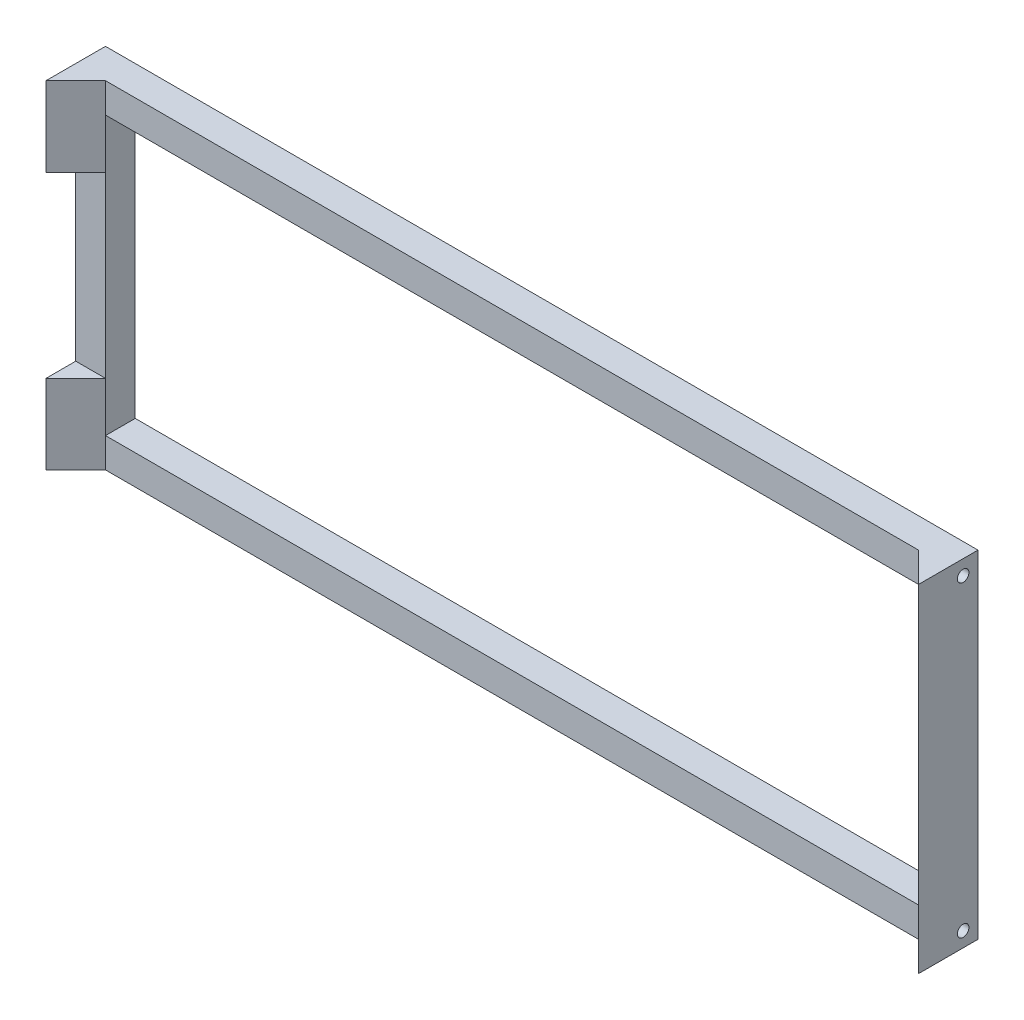
ISO-10303-21;
HEADER;
FILE_DESCRIPTION(('STEP AP214'),'2;1');
FILE_NAME('part.step','',(''),(''),'','','');
FILE_SCHEMA(('AUTOMOTIVE_DESIGN { 1 0 10303 214 1 1 1 1 }'));
ENDSEC;
DATA;
#1=APPLICATION_CONTEXT('core data for automotive mechanical design processes');
#2=APPLICATION_PROTOCOL_DEFINITION('international standard','automotive_design',2000,#1);
#3=PRODUCT_CONTEXT('',#1,'mechanical');
#4=PRODUCT('Part','Part','',(#3));
#5=PRODUCT_RELATED_PRODUCT_CATEGORY('part','',(#4));
#6=PRODUCT_DEFINITION_FORMATION('','',#4);
#7=PRODUCT_DEFINITION_CONTEXT('part definition',#1,'design');
#8=PRODUCT_DEFINITION('design','',#6,#7);
#9=PRODUCT_DEFINITION_SHAPE('','',#8);
#10=(LENGTH_UNIT() NAMED_UNIT(*) SI_UNIT(.MILLI.,.METRE.));
#11=(NAMED_UNIT(*) PLANE_ANGLE_UNIT() SI_UNIT($,.RADIAN.));
#12=(NAMED_UNIT(*) SI_UNIT($,.STERADIAN.) SOLID_ANGLE_UNIT());
#13=UNCERTAINTY_MEASURE_WITH_UNIT(LENGTH_MEASURE(1.E-05),#10,'distance_accuracy_value','');
#14=(GEOMETRIC_REPRESENTATION_CONTEXT(3) GLOBAL_UNCERTAINTY_ASSIGNED_CONTEXT((#13)) GLOBAL_UNIT_ASSIGNED_CONTEXT((#10,
#11,#12)) REPRESENTATION_CONTEXT('',''));
#15=CARTESIAN_POINT('',(0.,0.,0.));
#16=DIRECTION('',(0.,0.,1.));
#17=DIRECTION('',(1.,0.,0.));
#18=AXIS2_PLACEMENT_3D('',#15,#16,#17);
#19=CARTESIAN_POINT('',(0.,0.,7.5));
#20=DIRECTION('',(0.,0.,1.));
#21=DIRECTION('',(1.,0.,0.));
#22=AXIS2_PLACEMENT_3D('',#19,#20,#21);
#23=PLANE('',#22);
#24=DIRECTION('',(1.,0.,0.));
#25=VECTOR('',#24,1.);
#26=CARTESIAN_POINT('',(-102.5,-35.,7.5));
#27=LINE('',#26,#25);
#28=CARTESIAN_POINT('',(-102.5,-35.,7.5));
#29=VERTEX_POINT('',#28);
#30=CARTESIAN_POINT('',(102.5,-35.,7.5));
#31=VERTEX_POINT('',#30);
#32=EDGE_CURVE('E259',#29,#31,#27,.T.);
#33=ORIENTED_EDGE('',*,*,#32,.F.);
#34=DIRECTION('',(0.,-1.,0.));
#35=VECTOR('',#34,1.);
#36=CARTESIAN_POINT('',(-102.5,-22.5,7.5));
#37=LINE('',#36,#35);
#38=CARTESIAN_POINT('',(-102.5,-42.5,7.5));
#39=VERTEX_POINT('',#38);
#40=EDGE_CURVE('E167',#29,#39,#37,.T.);
#41=ORIENTED_EDGE('',*,*,#40,.T.);
#42=DIRECTION('',(1.,0.,0.));
#43=VECTOR('',#42,1.);
#44=CARTESIAN_POINT('',(-110.,-42.5,7.5));
#45=LINE('',#44,#43);
#46=CARTESIAN_POINT('',(102.5,-42.5,7.5));
#47=VERTEX_POINT('',#46);
#48=EDGE_CURVE('E303',#39,#47,#45,.T.);
#49=ORIENTED_EDGE('',*,*,#48,.T.);
#50=DIRECTION('',(0.,1.,0.));
#51=VECTOR('',#50,1.);
#52=CARTESIAN_POINT('',(102.5,-42.5,7.5));
#53=LINE('',#52,#51);
#54=EDGE_CURVE('E60',#47,#31,#53,.T.);
#55=ORIENTED_EDGE('',*,*,#54,.T.);
#56=EDGE_LOOP('',(#33,#41,#49,#55));
#57=FACE_BOUND('',#56,.T.);
#58=ADVANCED_FACE('F49',(#57),#23,.T.);
#59=DIRECTION('',(0.,-1.,0.));
#60=VECTOR('',#59,1.);
#61=CARTESIAN_POINT('',(-110.,-42.5,7.5));
#62=LINE('',#61,#60);
#63=CARTESIAN_POINT('',(-110.,22.5,7.5));
#64=VERTEX_POINT('',#63);
#65=CARTESIAN_POINT('',(-110.,-22.5,7.5));
#66=VERTEX_POINT('',#65);
#67=EDGE_CURVE('E299',#64,#66,#62,.T.);
#68=ORIENTED_EDGE('',*,*,#67,.T.);
#69=DIRECTION('',(-1.,0.,0.));
#70=VECTOR('',#69,1.);
#71=CARTESIAN_POINT('',(0.,-22.5,7.5));
#72=LINE('',#71,#70);
#73=CARTESIAN_POINT('',(-102.5,-22.5,7.5));
#74=VERTEX_POINT('',#73);
#75=EDGE_CURVE('E153',#74,#66,#72,.T.);
#76=ORIENTED_EDGE('',*,*,#75,.F.);
#77=DIRECTION('',(0.,-1.,0.));
#78=VECTOR('',#77,1.);
#79=CARTESIAN_POINT('',(-102.5,-35.,7.5));
#80=LINE('',#79,#78);
#81=CARTESIAN_POINT('',(-102.5,22.5,7.5));
#82=VERTEX_POINT('',#81);
#83=EDGE_CURVE('E253',#82,#74,#80,.T.);
#84=ORIENTED_EDGE('',*,*,#83,.F.);
#85=DIRECTION('',(-1.,0.,0.));
#86=VECTOR('',#85,1.);
#87=CARTESIAN_POINT('',(-102.5,22.5,7.5));
#88=LINE('',#87,#86);
#89=EDGE_CURVE('E185',#82,#64,#88,.T.);
#90=ORIENTED_EDGE('',*,*,#89,.T.);
#91=EDGE_LOOP('',(#68,#76,#84,#90));
#92=FACE_BOUND('',#91,.T.);
#93=ADVANCED_FACE('F406',(#92),#23,.T.);
#94=DIRECTION('',(0.,1.,0.));
#95=VECTOR('',#94,1.);
#96=CARTESIAN_POINT('',(-102.5,22.5,7.5));
#97=LINE('',#96,#95);
#98=CARTESIAN_POINT('',(-102.5,35.,7.5));
#99=VERTEX_POINT('',#98);
#100=CARTESIAN_POINT('',(-102.5,42.5,7.5));
#101=VERTEX_POINT('',#100);
#102=EDGE_CURVE('E199',#99,#101,#97,.T.);
#103=ORIENTED_EDGE('',*,*,#102,.F.);
#104=DIRECTION('',(-1.,0.,0.));
#105=VECTOR('',#104,1.);
#106=CARTESIAN_POINT('',(-102.5,35.,7.5));
#107=LINE('',#106,#105);
#108=CARTESIAN_POINT('',(102.5,35.,7.5));
#109=VERTEX_POINT('',#108);
#110=EDGE_CURVE('E249',#109,#99,#107,.T.);
#111=ORIENTED_EDGE('',*,*,#110,.F.);
#112=CARTESIAN_POINT('',(102.5,42.5,7.5));
#113=VERTEX_POINT('',#112);
#114=EDGE_CURVE('E11',#109,#113,#53,.T.);
#115=ORIENTED_EDGE('',*,*,#114,.T.);
#116=DIRECTION('',(-1.,0.,0.));
#117=VECTOR('',#116,1.);
#118=CARTESIAN_POINT('',(-110.,42.5,7.5));
#119=LINE('',#118,#117);
#120=EDGE_CURVE('E295',#113,#101,#119,.T.);
#121=ORIENTED_EDGE('',*,*,#120,.T.);
#122=EDGE_LOOP('',(#103,#111,#115,#121));
#123=FACE_BOUND('',#122,.T.);
#124=ADVANCED_FACE('F419',(#123),#23,.T.);
#125=CARTESIAN_POINT('',(0.,0.,0.));
#126=DIRECTION('',(0.,0.,1.));
#127=DIRECTION('',(1.,0.,0.));
#128=AXIS2_PLACEMENT_3D('',#125,#126,#127);
#129=PLANE('',#128);
#130=DIRECTION('',(-1.,0.,0.));
#131=VECTOR('',#130,1.);
#132=CARTESIAN_POINT('',(-110.,42.5,0.));
#133=LINE('',#132,#131);
#134=CARTESIAN_POINT('',(110.,42.5,0.));
#135=VERTEX_POINT('',#134);
#136=CARTESIAN_POINT('',(-110.,42.5,0.));
#137=VERTEX_POINT('',#136);
#138=EDGE_CURVE('E294',#135,#137,#133,.T.);
#139=ORIENTED_EDGE('',*,*,#138,.F.);
#140=DIRECTION('',(0.,1.,0.));
#141=VECTOR('',#140,1.);
#142=CARTESIAN_POINT('',(110.,-42.5,0.));
#143=LINE('',#142,#141);
#144=CARTESIAN_POINT('',(110.,-42.5,0.));
#145=VERTEX_POINT('',#144);
#146=EDGE_CURVE('E300',#145,#135,#143,.T.);
#147=ORIENTED_EDGE('',*,*,#146,.F.);
#148=DIRECTION('',(1.,0.,0.));
#149=VECTOR('',#148,1.);
#150=CARTESIAN_POINT('',(-110.,-42.5,0.));
#151=LINE('',#150,#149);
#152=CARTESIAN_POINT('',(-110.,-42.5,0.));
#153=VERTEX_POINT('',#152);
#154=EDGE_CURVE('E313',#153,#145,#151,.T.);
#155=ORIENTED_EDGE('',*,*,#154,.F.);
#156=DIRECTION('',(0.,-1.,0.));
#157=VECTOR('',#156,1.);
#158=CARTESIAN_POINT('',(-110.,-42.5,0.));
#159=LINE('',#158,#157);
#160=EDGE_CURVE('E310',#137,#153,#159,.T.);
#161=ORIENTED_EDGE('',*,*,#160,.F.);
#162=EDGE_LOOP('',(#139,#147,#155,#161));
#163=FACE_BOUND('',#162,.T.);
#164=DIRECTION('',(-1.,0.,0.));
#165=VECTOR('',#164,1.);
#166=CARTESIAN_POINT('',(-102.5,35.,0.));
#167=LINE('',#166,#165);
#168=CARTESIAN_POINT('',(102.5,35.,0.));
#169=VERTEX_POINT('',#168);
#170=CARTESIAN_POINT('',(-102.5,35.,0.));
#171=VERTEX_POINT('',#170);
#172=EDGE_CURVE('E237',#169,#171,#167,.T.);
#173=ORIENTED_EDGE('',*,*,#172,.T.);
#174=DIRECTION('',(0.,-1.,0.));
#175=VECTOR('',#174,1.);
#176=CARTESIAN_POINT('',(-102.5,-35.,0.));
#177=LINE('',#176,#175);
#178=CARTESIAN_POINT('',(-102.5,-35.,0.));
#179=VERTEX_POINT('',#178);
#180=EDGE_CURVE('E271',#171,#179,#177,.T.);
#181=ORIENTED_EDGE('',*,*,#180,.T.);
#182=DIRECTION('',(1.,0.,0.));
#183=VECTOR('',#182,1.);
#184=CARTESIAN_POINT('',(-102.5,-35.,0.));
#185=LINE('',#184,#183);
#186=CARTESIAN_POINT('',(102.5,-35.,0.));
#187=VERTEX_POINT('',#186);
#188=EDGE_CURVE('E274',#179,#187,#185,.T.);
#189=ORIENTED_EDGE('',*,*,#188,.T.);
#190=DIRECTION('',(0.,1.,0.));
#191=VECTOR('',#190,1.);
#192=CARTESIAN_POINT('',(102.5,-35.,0.));
#193=LINE('',#192,#191);
#194=EDGE_CURVE('E254',#187,#169,#193,.T.);
#195=ORIENTED_EDGE('',*,*,#194,.T.);
#196=EDGE_LOOP('',(#173,#181,#189,#195));
#197=FACE_BOUND('',#196,.T.);
#198=ADVANCED_FACE('F336',(#163,#197),#129,.F.);
#199=CARTESIAN_POINT('',(-110.,42.5,7.5));
#200=DIRECTION('',(0.,-1.,0.));
#201=DIRECTION('',(1.,0.,0.));
#202=AXIS2_PLACEMENT_3D('',#199,#200,#201);
#203=PLANE('',#202);
#204=ORIENTED_EDGE('',*,*,#138,.T.);
#205=DIRECTION('',(0.,0.,-1.));
#206=VECTOR('',#205,1.);
#207=CARTESIAN_POINT('',(-110.,42.5,7.5));
#208=LINE('',#207,#206);
#209=CARTESIAN_POINT('',(-110.,42.5,15.));
#210=VERTEX_POINT('',#209);
#211=EDGE_CURVE('E53',#210,#137,#208,.T.);
#212=ORIENTED_EDGE('',*,*,#211,.F.);
#213=DIRECTION('',(0.707106781186547,0.,-0.707106781186548));
#214=VECTOR('',#213,1.);
#215=CARTESIAN_POINT('',(-110.,42.5,15.));
#216=LINE('',#215,#214);
#217=EDGE_CURVE('E183',#210,#101,#216,.T.);
#218=ORIENTED_EDGE('',*,*,#217,.T.);
#219=ORIENTED_EDGE('',*,*,#120,.F.);
#220=DIRECTION('',(-0.707106781186547,0.,-0.707106781186548));
#221=VECTOR('',#220,1.);
#222=CARTESIAN_POINT('',(110.,42.5,15.));
#223=LINE('',#222,#221);
#224=CARTESIAN_POINT('',(110.,42.5,15.));
#225=VERTEX_POINT('',#224);
#226=EDGE_CURVE('E75',#225,#113,#223,.T.);
#227=ORIENTED_EDGE('',*,*,#226,.F.);
#228=DIRECTION('',(0.,0.,-1.));
#229=VECTOR('',#228,1.);
#230=CARTESIAN_POINT('',(110.,42.5,7.5));
#231=LINE('',#230,#229);
#232=EDGE_CURVE('E306',#225,#135,#231,.T.);
#233=ORIENTED_EDGE('',*,*,#232,.T.);
#234=EDGE_LOOP('',(#204,#212,#218,#219,#227,#233));
#235=FACE_BOUND('',#234,.T.);
#236=ADVANCED_FACE('F51',(#235),#203,.F.);
#237=CARTESIAN_POINT('',(-110.,-42.5,7.5));
#238=DIRECTION('',(1.,0.,0.));
#239=DIRECTION('',(0.,0.,-1.));
#240=AXIS2_PLACEMENT_3D('',#237,#238,#239);
#241=PLANE('',#240);
#242=CARTESIAN_POINT('',(-110.,38.75,3.75));
#243=DIRECTION('',(-1.,0.,0.));
#244=DIRECTION('',(0.,0.,1.));
#245=AXIS2_PLACEMENT_3D('',#242,#243,#244);
#246=CIRCLE('',#245,1.45);
#247=CARTESIAN_POINT('',(-110.,38.75,5.2));
#248=VERTEX_POINT('',#247);
#249=EDGE_CURVE('E238',#248,#248,#246,.T.);
#250=ORIENTED_EDGE('',*,*,#249,.F.);
#251=EDGE_LOOP('',(#250));
#252=FACE_BOUND('',#251,.T.);
#253=CARTESIAN_POINT('',(-110.,-38.75,3.75));
#254=DIRECTION('',(-1.,0.,0.));
#255=DIRECTION('',(0.,0.,1.));
#256=AXIS2_PLACEMENT_3D('',#253,#254,#255);
#257=CIRCLE('',#256,1.45);
#258=CARTESIAN_POINT('',(-110.,-38.75,5.2));
#259=VERTEX_POINT('',#258);
#260=EDGE_CURVE('E242',#259,#259,#257,.T.);
#261=ORIENTED_EDGE('',*,*,#260,.F.);
#262=EDGE_LOOP('',(#261));
#263=FACE_BOUND('',#262,.T.);
#264=ORIENTED_EDGE('',*,*,#160,.T.);
#265=DIRECTION('',(0.,0.,-1.));
#266=VECTOR('',#265,1.);
#267=CARTESIAN_POINT('',(-110.,-42.5,7.5));
#268=LINE('',#267,#266);
#269=CARTESIAN_POINT('',(-110.,-42.5,15.));
#270=VERTEX_POINT('',#269);
#271=EDGE_CURVE('E163',#270,#153,#268,.T.);
#272=ORIENTED_EDGE('',*,*,#271,.F.);
#273=DIRECTION('',(0.,-1.,0.));
#274=VECTOR('',#273,1.);
#275=CARTESIAN_POINT('',(-110.,-22.5,15.));
#276=LINE('',#275,#274);
#277=CARTESIAN_POINT('',(-110.,-22.5,15.));
#278=VERTEX_POINT('',#277);
#279=EDGE_CURVE('E160',#278,#270,#276,.T.);
#280=ORIENTED_EDGE('',*,*,#279,.F.);
#281=DIRECTION('',(0.,0.,1.));
#282=VECTOR('',#281,1.);
#283=CARTESIAN_POINT('',(-110.,-22.5,0.));
#284=LINE('',#283,#282);
#285=EDGE_CURVE('E146',#66,#278,#284,.T.);
#286=ORIENTED_EDGE('',*,*,#285,.F.);
#287=ORIENTED_EDGE('',*,*,#67,.F.);
#288=DIRECTION('',(0.,0.,1.));
#289=VECTOR('',#288,1.);
#290=CARTESIAN_POINT('',(-110.,22.5,7.5));
#291=LINE('',#290,#289);
#292=CARTESIAN_POINT('',(-110.,22.5,15.));
#293=VERTEX_POINT('',#292);
#294=EDGE_CURVE('E189',#64,#293,#291,.T.);
#295=ORIENTED_EDGE('',*,*,#294,.T.);
#296=DIRECTION('',(0.,1.,0.));
#297=VECTOR('',#296,1.);
#298=CARTESIAN_POINT('',(-110.,22.5,15.));
#299=LINE('',#298,#297);
#300=EDGE_CURVE('E195',#293,#210,#299,.T.);
#301=ORIENTED_EDGE('',*,*,#300,.T.);
#302=ORIENTED_EDGE('',*,*,#211,.T.);
#303=EDGE_LOOP('',(#264,#272,#280,#286,#287,#295,#301,#302));
#304=FACE_BOUND('',#303,.T.);
#305=ADVANCED_FACE('F161',(#252,#263,#304),#241,.F.);
#306=CARTESIAN_POINT('',(-110.,-42.5,7.5));
#307=DIRECTION('',(0.,1.,0.));
#308=DIRECTION('',(0.,0.,1.));
#309=AXIS2_PLACEMENT_3D('',#306,#307,#308);
#310=PLANE('',#309);
#311=ORIENTED_EDGE('',*,*,#154,.T.);
#312=DIRECTION('',(0.,0.,-1.));
#313=VECTOR('',#312,1.);
#314=CARTESIAN_POINT('',(110.,-42.5,7.5));
#315=LINE('',#314,#313);
#316=CARTESIAN_POINT('',(110.,-42.5,15.));
#317=VERTEX_POINT('',#316);
#318=EDGE_CURVE('E321',#317,#145,#315,.T.);
#319=ORIENTED_EDGE('',*,*,#318,.F.);
#320=DIRECTION('',(-0.707106781186547,0.,-0.707106781186548));
#321=VECTOR('',#320,1.);
#322=CARTESIAN_POINT('',(110.,-42.5,15.));
#323=LINE('',#322,#321);
#324=EDGE_CURVE('E205',#317,#47,#323,.T.);
#325=ORIENTED_EDGE('',*,*,#324,.T.);
#326=ORIENTED_EDGE('',*,*,#48,.F.);
#327=DIRECTION('',(0.707106781186547,0.,-0.707106781186548));
#328=VECTOR('',#327,1.);
#329=CARTESIAN_POINT('',(-47.5000000000001,-42.5,-47.5));
#330=LINE('',#329,#328);
#331=EDGE_CURVE('E173',#270,#39,#330,.T.);
#332=ORIENTED_EDGE('',*,*,#331,.F.);
#333=ORIENTED_EDGE('',*,*,#271,.T.);
#334=EDGE_LOOP('',(#311,#319,#325,#326,#332,#333));
#335=FACE_BOUND('',#334,.T.);
#336=ADVANCED_FACE('F338',(#335),#310,.F.);
#337=CARTESIAN_POINT('',(110.,-42.5,7.5));
#338=DIRECTION('',(-1.,0.,0.));
#339=DIRECTION('',(0.,0.,1.));
#340=AXIS2_PLACEMENT_3D('',#337,#338,#339);
#341=PLANE('',#340);
#342=CARTESIAN_POINT('',(110.,-38.75,3.75));
#343=DIRECTION('',(1.,0.,0.));
#344=DIRECTION('',(0.,0.,-1.));
#345=AXIS2_PLACEMENT_3D('',#342,#343,#344);
#346=CIRCLE('',#345,1.45);
#347=CARTESIAN_POINT('',(110.,-38.75,2.3));
#348=VERTEX_POINT('',#347);
#349=EDGE_CURVE('E222',#348,#348,#346,.T.);
#350=ORIENTED_EDGE('',*,*,#349,.F.);
#351=EDGE_LOOP('',(#350));
#352=FACE_BOUND('',#351,.T.);
#353=CARTESIAN_POINT('',(110.,38.75,3.75));
#354=DIRECTION('',(1.,0.,0.));
#355=DIRECTION('',(0.,0.,-1.));
#356=AXIS2_PLACEMENT_3D('',#353,#354,#355);
#357=CIRCLE('',#356,1.45);
#358=CARTESIAN_POINT('',(110.,38.75,2.3));
#359=VERTEX_POINT('',#358);
#360=EDGE_CURVE('E226',#359,#359,#357,.T.);
#361=ORIENTED_EDGE('',*,*,#360,.F.);
#362=EDGE_LOOP('',(#361));
#363=FACE_BOUND('',#362,.T.);
#364=ORIENTED_EDGE('',*,*,#146,.T.);
#365=ORIENTED_EDGE('',*,*,#232,.F.);
#366=DIRECTION('',(0.,1.,0.));
#367=VECTOR('',#366,1.);
#368=CARTESIAN_POINT('',(110.,-42.5,15.));
#369=LINE('',#368,#367);
#370=EDGE_CURVE('E213',#317,#225,#369,.T.);
#371=ORIENTED_EDGE('',*,*,#370,.F.);
#372=ORIENTED_EDGE('',*,*,#318,.T.);
#373=EDGE_LOOP('',(#364,#365,#371,#372));
#374=FACE_BOUND('',#373,.T.);
#375=ADVANCED_FACE('F342',(#352,#363,#374),#341,.F.);
#376=CARTESIAN_POINT('',(-102.5,35.,7.5));
#377=DIRECTION('',(0.,-1.,0.));
#378=DIRECTION('',(0.,0.,-1.));
#379=AXIS2_PLACEMENT_3D('',#376,#377,#378);
#380=PLANE('',#379);
#381=ORIENTED_EDGE('',*,*,#172,.F.);
#382=DIRECTION('',(0.,0.,-1.));
#383=VECTOR('',#382,1.);
#384=CARTESIAN_POINT('',(102.5,35.,7.5));
#385=LINE('',#384,#383);
#386=EDGE_CURVE('E267',#109,#169,#385,.T.);
#387=ORIENTED_EDGE('',*,*,#386,.F.);
#388=ORIENTED_EDGE('',*,*,#110,.T.);
#389=DIRECTION('',(0.,0.,-1.));
#390=VECTOR('',#389,1.);
#391=CARTESIAN_POINT('',(-102.5,35.,7.5));
#392=LINE('',#391,#390);
#393=EDGE_CURVE('E290',#99,#171,#392,.T.);
#394=ORIENTED_EDGE('',*,*,#393,.T.);
#395=EDGE_LOOP('',(#381,#387,#388,#394));
#396=FACE_BOUND('',#395,.T.);
#397=ADVANCED_FACE('F433',(#396),#380,.T.);
#398=CARTESIAN_POINT('',(-102.5,-35.,7.5));
#399=DIRECTION('',(1.,0.,0.));
#400=DIRECTION('',(0.,0.,-1.));
#401=AXIS2_PLACEMENT_3D('',#398,#399,#400);
#402=PLANE('',#401);
#403=ORIENTED_EDGE('',*,*,#180,.F.);
#404=ORIENTED_EDGE('',*,*,#393,.F.);
#405=EDGE_CURVE('E255',#99,#82,#80,.T.);
#406=ORIENTED_EDGE('',*,*,#405,.T.);
#407=ORIENTED_EDGE('',*,*,#83,.T.);
#408=EDGE_CURVE('E171',#74,#29,#37,.T.);
#409=ORIENTED_EDGE('',*,*,#408,.T.);
#410=DIRECTION('',(0.,0.,-1.));
#411=VECTOR('',#410,1.);
#412=CARTESIAN_POINT('',(-102.5,-35.,7.5));
#413=LINE('',#412,#411);
#414=EDGE_CURVE('E287',#29,#179,#413,.T.);
#415=ORIENTED_EDGE('',*,*,#414,.T.);
#416=EDGE_LOOP('',(#403,#404,#406,#407,#409,#415));
#417=FACE_BOUND('',#416,.T.);
#418=ADVANCED_FACE('F402',(#417),#402,.T.);
#419=CARTESIAN_POINT('',(-102.5,-35.,7.5));
#420=DIRECTION('',(0.,1.,0.));
#421=DIRECTION('',(0.,0.,1.));
#422=AXIS2_PLACEMENT_3D('',#419,#420,#421);
#423=PLANE('',#422);
#424=ORIENTED_EDGE('',*,*,#188,.F.);
#425=ORIENTED_EDGE('',*,*,#414,.F.);
#426=ORIENTED_EDGE('',*,*,#32,.T.);
#427=DIRECTION('',(0.,0.,-1.));
#428=VECTOR('',#427,1.);
#429=CARTESIAN_POINT('',(102.5,-35.,7.5));
#430=LINE('',#429,#428);
#431=EDGE_CURVE('E284',#31,#187,#430,.T.);
#432=ORIENTED_EDGE('',*,*,#431,.T.);
#433=EDGE_LOOP('',(#424,#425,#426,#432));
#434=FACE_BOUND('',#433,.T.);
#435=ADVANCED_FACE('F439',(#434),#423,.T.);
#436=CARTESIAN_POINT('',(102.5,-35.,7.5));
#437=DIRECTION('',(-1.,0.,0.));
#438=DIRECTION('',(0.,0.,1.));
#439=AXIS2_PLACEMENT_3D('',#436,#437,#438);
#440=PLANE('',#439);
#441=ORIENTED_EDGE('',*,*,#194,.F.);
#442=ORIENTED_EDGE('',*,*,#431,.F.);
#443=DIRECTION('',(0.,1.,0.));
#444=VECTOR('',#443,1.);
#445=CARTESIAN_POINT('',(102.5,-35.,7.5));
#446=LINE('',#445,#444);
#447=EDGE_CURVE('E263',#31,#109,#446,.T.);
#448=ORIENTED_EDGE('',*,*,#447,.T.);
#449=ORIENTED_EDGE('',*,*,#386,.T.);
#450=EDGE_LOOP('',(#441,#442,#448,#449));
#451=FACE_BOUND('',#450,.T.);
#452=ADVANCED_FACE('F437',(#451),#440,.T.);
#453=CARTESIAN_POINT('',(-100.,-38.75,3.75));
#454=DIRECTION('',(-1.,0.,0.));
#455=DIRECTION('',(0.,0.,1.));
#456=AXIS2_PLACEMENT_3D('',#453,#454,#455);
#457=CYLINDRICAL_SURFACE('',#456,1.45);
#458=CARTESIAN_POINT('',(-100.,-38.75,3.75));
#459=DIRECTION('',(-1.,0.,0.));
#460=DIRECTION('',(0.,0.,1.));
#461=AXIS2_PLACEMENT_3D('',#458,#459,#460);
#462=CIRCLE('',#461,1.45);
#463=CARTESIAN_POINT('',(-100.,-38.75,5.2));
#464=VERTEX_POINT('',#463);
#465=EDGE_CURVE('E221',#464,#464,#462,.T.);
#466=ORIENTED_EDGE('',*,*,#465,.F.);
#467=EDGE_LOOP('',(#466));
#468=FACE_BOUND('',#467,.T.);
#469=ORIENTED_EDGE('',*,*,#260,.T.);
#470=EDGE_LOOP('',(#469));
#471=FACE_BOUND('',#470,.T.);
#472=ADVANCED_FACE('F445',(#468,#471),#457,.F.);
#473=CARTESIAN_POINT('',(-100.,-38.75,3.75));
#474=DIRECTION('',(-1.,0.,0.));
#475=DIRECTION('',(0.,0.,1.));
#476=AXIS2_PLACEMENT_3D('',#473,#474,#475);
#477=PLANE('',#476);
#478=ORIENTED_EDGE('',*,*,#465,.T.);
#479=EDGE_LOOP('',(#478));
#480=FACE_BOUND('',#479,.T.);
#481=ADVANCED_FACE('F468',(#480),#477,.T.);
#482=CARTESIAN_POINT('',(-100.,38.75,3.75));
#483=DIRECTION('',(-1.,0.,0.));
#484=DIRECTION('',(0.,0.,1.));
#485=AXIS2_PLACEMENT_3D('',#482,#483,#484);
#486=CYLINDRICAL_SURFACE('',#485,1.45);
#487=CARTESIAN_POINT('',(-100.,38.75,3.75));
#488=DIRECTION('',(-1.,0.,0.));
#489=DIRECTION('',(0.,0.,1.));
#490=AXIS2_PLACEMENT_3D('',#487,#488,#489);
#491=CIRCLE('',#490,1.45);
#492=CARTESIAN_POINT('',(-100.,38.75,5.2));
#493=VERTEX_POINT('',#492);
#494=EDGE_CURVE('E233',#493,#493,#491,.T.);
#495=ORIENTED_EDGE('',*,*,#494,.F.);
#496=EDGE_LOOP('',(#495));
#497=FACE_BOUND('',#496,.T.);
#498=ORIENTED_EDGE('',*,*,#249,.T.);
#499=EDGE_LOOP('',(#498));
#500=FACE_BOUND('',#499,.T.);
#501=ADVANCED_FACE('F473',(#497,#500),#486,.F.);
#502=CARTESIAN_POINT('',(-100.,38.75,3.75));
#503=DIRECTION('',(-1.,0.,0.));
#504=DIRECTION('',(0.,0.,1.));
#505=AXIS2_PLACEMENT_3D('',#502,#503,#504);
#506=PLANE('',#505);
#507=ORIENTED_EDGE('',*,*,#494,.T.);
#508=EDGE_LOOP('',(#507));
#509=FACE_BOUND('',#508,.T.);
#510=ADVANCED_FACE('F479',(#509),#506,.T.);
#511=CARTESIAN_POINT('',(100.,38.75,3.75));
#512=DIRECTION('',(1.,0.,0.));
#513=DIRECTION('',(0.,0.,-1.));
#514=AXIS2_PLACEMENT_3D('',#511,#512,#513);
#515=CYLINDRICAL_SURFACE('',#514,1.45);
#516=CARTESIAN_POINT('',(100.,38.75,3.75));
#517=DIRECTION('',(1.,0.,0.));
#518=DIRECTION('',(0.,0.,-1.));
#519=AXIS2_PLACEMENT_3D('',#516,#517,#518);
#520=CIRCLE('',#519,1.45);
#521=CARTESIAN_POINT('',(100.,38.75,2.3));
#522=VERTEX_POINT('',#521);
#523=EDGE_CURVE('E216',#522,#522,#520,.T.);
#524=ORIENTED_EDGE('',*,*,#523,.F.);
#525=EDGE_LOOP('',(#524));
#526=FACE_BOUND('',#525,.T.);
#527=ORIENTED_EDGE('',*,*,#360,.T.);
#528=EDGE_LOOP('',(#527));
#529=FACE_BOUND('',#528,.T.);
#530=ADVANCED_FACE('F483',(#526,#529),#515,.F.);
#531=CARTESIAN_POINT('',(100.,38.75,3.75));
#532=DIRECTION('',(1.,0.,0.));
#533=DIRECTION('',(0.,0.,-1.));
#534=AXIS2_PLACEMENT_3D('',#531,#532,#533);
#535=PLANE('',#534);
#536=ORIENTED_EDGE('',*,*,#523,.T.);
#537=EDGE_LOOP('',(#536));
#538=FACE_BOUND('',#537,.T.);
#539=ADVANCED_FACE('F485',(#538),#535,.T.);
#540=CARTESIAN_POINT('',(100.,-38.75,3.75));
#541=DIRECTION('',(1.,0.,0.));
#542=DIRECTION('',(0.,0.,-1.));
#543=AXIS2_PLACEMENT_3D('',#540,#541,#542);
#544=CYLINDRICAL_SURFACE('',#543,1.45);
#545=CARTESIAN_POINT('',(100.,-38.75,3.75));
#546=DIRECTION('',(1.,0.,0.));
#547=DIRECTION('',(0.,0.,-1.));
#548=AXIS2_PLACEMENT_3D('',#545,#546,#547);
#549=CIRCLE('',#548,1.45);
#550=CARTESIAN_POINT('',(100.,-38.75,2.3));
#551=VERTEX_POINT('',#550);
#552=EDGE_CURVE('E217',#551,#551,#549,.T.);
#553=ORIENTED_EDGE('',*,*,#552,.F.);
#554=EDGE_LOOP('',(#553));
#555=FACE_BOUND('',#554,.T.);
#556=ORIENTED_EDGE('',*,*,#349,.T.);
#557=EDGE_LOOP('',(#556));
#558=FACE_BOUND('',#557,.T.);
#559=ADVANCED_FACE('F488',(#555,#558),#544,.F.);
#560=CARTESIAN_POINT('',(100.,-38.75,3.75));
#561=DIRECTION('',(1.,0.,0.));
#562=DIRECTION('',(0.,0.,-1.));
#563=AXIS2_PLACEMENT_3D('',#560,#561,#562);
#564=PLANE('',#563);
#565=ORIENTED_EDGE('',*,*,#552,.T.);
#566=EDGE_LOOP('',(#565));
#567=FACE_BOUND('',#566,.T.);
#568=ADVANCED_FACE('F495',(#567),#564,.T.);
#569=CARTESIAN_POINT('',(110.,-42.5,15.));
#570=DIRECTION('',(0.707106781186548,0.,-0.707106781186547));
#571=DIRECTION('',(-0.707106781186547,0.,-0.707106781186548));
#572=AXIS2_PLACEMENT_3D('',#569,#570,#571);
#573=PLANE('',#572);
#574=ORIENTED_EDGE('',*,*,#226,.T.);
#575=ORIENTED_EDGE('',*,*,#114,.F.);
#576=ORIENTED_EDGE('',*,*,#447,.F.);
#577=ORIENTED_EDGE('',*,*,#54,.F.);
#578=ORIENTED_EDGE('',*,*,#324,.F.);
#579=ORIENTED_EDGE('',*,*,#370,.T.);
#580=EDGE_LOOP('',(#574,#575,#576,#577,#578,#579));
#581=FACE_BOUND('',#580,.T.);
#582=ADVANCED_FACE('F343',(#581),#573,.F.);
#583=CARTESIAN_POINT('',(-110.,22.5,15.));
#584=DIRECTION('',(0.707106781186548,0.,0.707106781186547));
#585=DIRECTION('',(0.707106781186547,0.,-0.707106781186548));
#586=AXIS2_PLACEMENT_3D('',#583,#584,#585);
#587=PLANE('',#586);
#588=ORIENTED_EDGE('',*,*,#217,.F.);
#589=ORIENTED_EDGE('',*,*,#300,.F.);
#590=DIRECTION('',(0.707106781186547,0.,-0.707106781186548));
#591=VECTOR('',#590,1.);
#592=CARTESIAN_POINT('',(-110.,22.5,15.));
#593=LINE('',#592,#591);
#594=EDGE_CURVE('E67',#293,#82,#593,.T.);
#595=ORIENTED_EDGE('',*,*,#594,.T.);
#596=ORIENTED_EDGE('',*,*,#405,.F.);
#597=ORIENTED_EDGE('',*,*,#102,.T.);
#598=EDGE_LOOP('',(#588,#589,#595,#596,#597));
#599=FACE_BOUND('',#598,.T.);
#600=ADVANCED_FACE('F410',(#599),#587,.T.);
#601=CARTESIAN_POINT('',(0.,22.4999999999999,0.));
#602=DIRECTION('',(0.,1.,0.));
#603=DIRECTION('',(-1.,0.,0.));
#604=AXIS2_PLACEMENT_3D('',#601,#602,#603);
#605=PLANE('',#604);
#606=ORIENTED_EDGE('',*,*,#89,.F.);
#607=ORIENTED_EDGE('',*,*,#594,.F.);
#608=ORIENTED_EDGE('',*,*,#294,.F.);
#609=EDGE_LOOP('',(#606,#607,#608));
#610=FACE_BOUND('',#609,.T.);
#611=ADVANCED_FACE('F408',(#610),#605,.F.);
#612=CARTESIAN_POINT('',(-47.5000000000001,-22.5,-47.5));
#613=DIRECTION('',(-0.707106781186548,0.,-0.707106781186547));
#614=DIRECTION('',(-0.707106781186547,0.,0.707106781186548));
#615=AXIS2_PLACEMENT_3D('',#612,#613,#614);
#616=PLANE('',#615);
#617=ORIENTED_EDGE('',*,*,#331,.T.);
#618=ORIENTED_EDGE('',*,*,#40,.F.);
#619=ORIENTED_EDGE('',*,*,#408,.F.);
#620=DIRECTION('',(0.707106781186547,0.,-0.707106781186548));
#621=VECTOR('',#620,1.);
#622=CARTESIAN_POINT('',(-47.5000000000001,-22.5,-47.5));
#623=LINE('',#622,#621);
#624=EDGE_CURVE('E150',#278,#74,#623,.T.);
#625=ORIENTED_EDGE('',*,*,#624,.F.);
#626=ORIENTED_EDGE('',*,*,#279,.T.);
#627=EDGE_LOOP('',(#617,#618,#619,#625,#626));
#628=FACE_BOUND('',#627,.T.);
#629=ADVANCED_FACE('F169',(#628),#616,.F.);
#630=CARTESIAN_POINT('',(0.,-22.5,0.));
#631=DIRECTION('',(0.,-1.,0.));
#632=DIRECTION('',(0.,0.,-1.));
#633=AXIS2_PLACEMENT_3D('',#630,#631,#632);
#634=PLANE('',#633);
#635=ORIENTED_EDGE('',*,*,#624,.T.);
#636=ORIENTED_EDGE('',*,*,#75,.T.);
#637=ORIENTED_EDGE('',*,*,#285,.T.);
#638=EDGE_LOOP('',(#635,#636,#637));
#639=FACE_BOUND('',#638,.T.);
#640=ADVANCED_FACE('F148',(#639),#634,.F.);
#641=CLOSED_SHELL('',(#58,#93,#124,#198,#236,#305,#336,#375,#397,#418,#435,#452,#472,#481,#501,
#510,#530,#539,#559,#568,#582,#600,#611,#629,#640));
#642=MANIFOLD_SOLID_BREP('B2',#641);
#643=ADVANCED_BREP_SHAPE_REPRESENTATION('',(#18,#642),#14);
#644=SHAPE_DEFINITION_REPRESENTATION(#9,#643);
ENDSEC;
END-ISO-10303-21;
